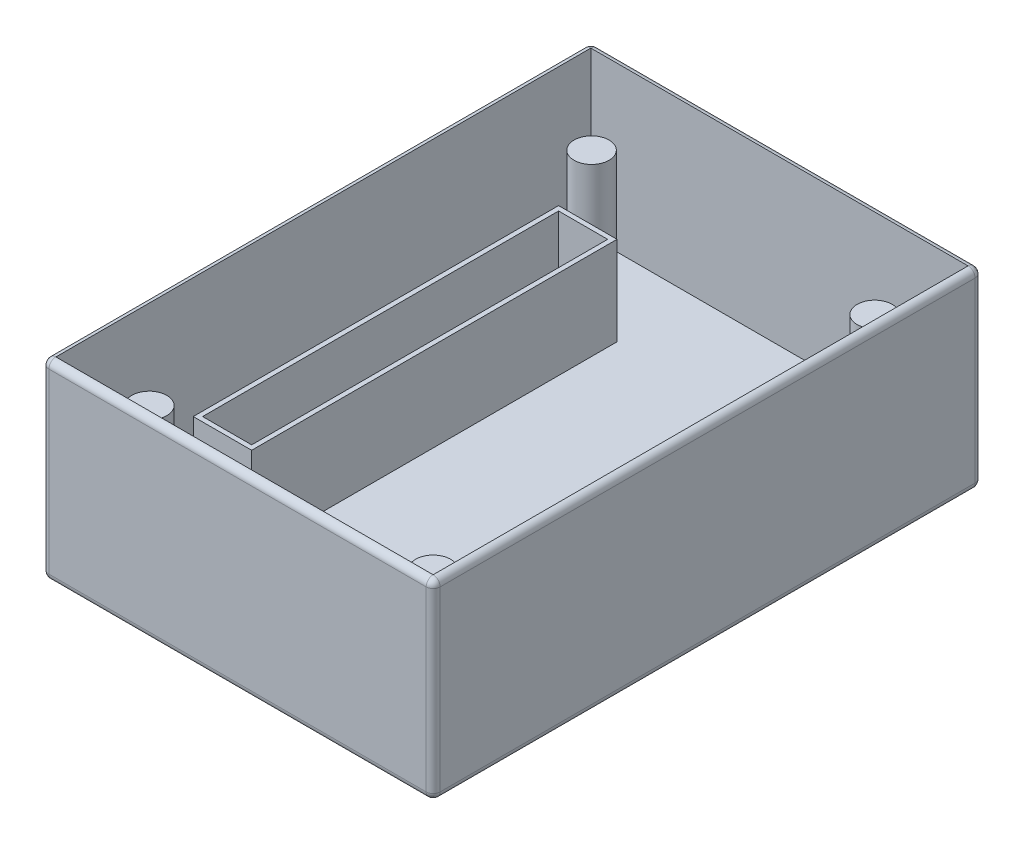
ISO-10303-21;
HEADER;
FILE_DESCRIPTION(('STEP AP214'),'2;1');
FILE_NAME('part.step','',(''),(''),'','','');
FILE_SCHEMA(('AUTOMOTIVE_DESIGN { 1 0 10303 214 1 1 1 1 }'));
ENDSEC;
DATA;
#1=APPLICATION_CONTEXT('core data for automotive mechanical design processes');
#2=APPLICATION_PROTOCOL_DEFINITION('international standard','automotive_design',2000,#1);
#3=PRODUCT_CONTEXT('',#1,'mechanical');
#4=PRODUCT('Part','Part','',(#3));
#5=PRODUCT_RELATED_PRODUCT_CATEGORY('part','',(#4));
#6=PRODUCT_DEFINITION_FORMATION('','',#4);
#7=PRODUCT_DEFINITION_CONTEXT('part definition',#1,'design');
#8=PRODUCT_DEFINITION('design','',#6,#7);
#9=PRODUCT_DEFINITION_SHAPE('','',#8);
#10=(LENGTH_UNIT() NAMED_UNIT(*) SI_UNIT(.MILLI.,.METRE.));
#11=(NAMED_UNIT(*) PLANE_ANGLE_UNIT() SI_UNIT($,.RADIAN.));
#12=(NAMED_UNIT(*) SI_UNIT($,.STERADIAN.) SOLID_ANGLE_UNIT());
#13=UNCERTAINTY_MEASURE_WITH_UNIT(LENGTH_MEASURE(1.E-05),#10,'distance_accuracy_value','');
#14=(GEOMETRIC_REPRESENTATION_CONTEXT(3) GLOBAL_UNCERTAINTY_ASSIGNED_CONTEXT((#13)) GLOBAL_UNIT_ASSIGNED_CONTEXT((#10,
#11,#12)) REPRESENTATION_CONTEXT('',''));
#15=CARTESIAN_POINT('',(0.,0.,0.));
#16=DIRECTION('',(0.,0.,1.));
#17=DIRECTION('',(1.,0.,0.));
#18=AXIS2_PLACEMENT_3D('',#15,#16,#17);
#19=CARTESIAN_POINT('',(0.,1.2,0.));
#20=DIRECTION('',(0.,1.,0.));
#21=DIRECTION('',(0.,0.,1.));
#22=AXIS2_PLACEMENT_3D('',#19,#20,#21);
#23=PLANE('',#22);
#24=CARTESIAN_POINT('',(2.3,1.2,2.26854426453604));
#25=DIRECTION('',(0.,1.,0.));
#26=DIRECTION('',(0.,0.,1.));
#27=AXIS2_PLACEMENT_3D('',#24,#25,#26);
#28=CIRCLE('',#27,0.75);
#29=CARTESIAN_POINT('',(2.3,1.2,3.01854426453604));
#30=VERTEX_POINT('',#29);
#31=EDGE_CURVE('E337',#30,#30,#28,.T.);
#32=ORIENTED_EDGE('',*,*,#31,.F.);
#33=EDGE_LOOP('',(#32));
#34=FACE_BOUND('',#33,.T.);
#35=CARTESIAN_POINT('',(2.3,1.2,21.2));
#36=DIRECTION('',(0.,1.,0.));
#37=DIRECTION('',(0.,0.,1.));
#38=AXIS2_PLACEMENT_3D('',#35,#36,#37);
#39=CIRCLE('',#38,0.75);
#40=CARTESIAN_POINT('',(2.3,1.2,21.95));
#41=VERTEX_POINT('',#40);
#42=EDGE_CURVE('E333',#41,#41,#39,.T.);
#43=ORIENTED_EDGE('',*,*,#42,.F.);
#44=EDGE_LOOP('',(#43));
#45=FACE_BOUND('',#44,.T.);
#46=CARTESIAN_POINT('',(14.45,1.2,21.2));
#47=DIRECTION('',(0.,1.,0.));
#48=DIRECTION('',(0.,0.,1.));
#49=AXIS2_PLACEMENT_3D('',#46,#47,#48);
#50=CIRCLE('',#49,0.75);
#51=CARTESIAN_POINT('',(14.45,1.2,21.95));
#52=VERTEX_POINT('',#51);
#53=EDGE_CURVE('E342',#52,#52,#50,.T.);
#54=ORIENTED_EDGE('',*,*,#53,.F.);
#55=EDGE_LOOP('',(#54));
#56=FACE_BOUND('',#55,.T.);
#57=CARTESIAN_POINT('',(14.45,1.2,2.3));
#58=DIRECTION('',(0.,1.,0.));
#59=DIRECTION('',(0.,0.,1.));
#60=AXIS2_PLACEMENT_3D('',#57,#58,#59);
#61=CIRCLE('',#60,0.75);
#62=CARTESIAN_POINT('',(14.45,1.2,3.05));
#63=VERTEX_POINT('',#62);
#64=EDGE_CURVE('E350',#63,#63,#61,.T.);
#65=ORIENTED_EDGE('',*,*,#64,.F.);
#66=EDGE_LOOP('',(#65));
#67=FACE_BOUND('',#66,.T.);
#68=DIRECTION('',(0.,0.,1.));
#69=VECTOR('',#68,1.);
#70=CARTESIAN_POINT('',(0.300000000000005,1.2,23.2));
#71=LINE('',#70,#69);
#72=CARTESIAN_POINT('',(0.3,1.2,0.3));
#73=VERTEX_POINT('',#72);
#74=CARTESIAN_POINT('',(0.300000000000005,1.2,23.2));
#75=VERTEX_POINT('',#74);
#76=EDGE_CURVE('E290',#73,#75,#71,.T.);
#77=ORIENTED_EDGE('',*,*,#76,.T.);
#78=DIRECTION('',(1.,0.,0.));
#79=VECTOR('',#78,1.);
#80=CARTESIAN_POINT('',(16.45,1.2,23.2));
#81=LINE('',#80,#79);
#82=CARTESIAN_POINT('',(16.45,1.2,23.2));
#83=VERTEX_POINT('',#82);
#84=EDGE_CURVE('E309',#75,#83,#81,.T.);
#85=ORIENTED_EDGE('',*,*,#84,.T.);
#86=DIRECTION('',(0.,0.,-1.));
#87=VECTOR('',#86,1.);
#88=CARTESIAN_POINT('',(16.45,1.2,0.3));
#89=LINE('',#88,#87);
#90=CARTESIAN_POINT('',(16.45,1.2,0.3));
#91=VERTEX_POINT('',#90);
#92=EDGE_CURVE('E312',#83,#91,#89,.T.);
#93=ORIENTED_EDGE('',*,*,#92,.T.);
#94=DIRECTION('',(-1.,0.,0.));
#95=VECTOR('',#94,1.);
#96=CARTESIAN_POINT('',(0.3,1.2,0.3));
#97=LINE('',#96,#95);
#98=EDGE_CURVE('E296',#91,#73,#97,.T.);
#99=ORIENTED_EDGE('',*,*,#98,.T.);
#100=EDGE_LOOP('',(#77,#85,#93,#99));
#101=FACE_BOUND('',#100,.T.);
#102=DIRECTION('',(1.,0.,0.));
#103=VECTOR('',#102,1.);
#104=CARTESIAN_POINT('',(4.75000000000001,1.2,19.27));
#105=LINE('',#104,#103);
#106=CARTESIAN_POINT('',(2.25,1.2,19.27));
#107=VERTEX_POINT('',#106);
#108=CARTESIAN_POINT('',(4.75000000000001,1.2,19.27));
#109=VERTEX_POINT('',#108);
#110=EDGE_CURVE('E267',#107,#109,#105,.T.);
#111=ORIENTED_EDGE('',*,*,#110,.F.);
#112=DIRECTION('',(0.,0.,1.));
#113=VECTOR('',#112,1.);
#114=CARTESIAN_POINT('',(2.25,1.2,3.63));
#115=LINE('',#114,#113);
#116=CARTESIAN_POINT('',(2.25,1.2,3.63));
#117=VERTEX_POINT('',#116);
#118=EDGE_CURVE('E216',#117,#107,#115,.T.);
#119=ORIENTED_EDGE('',*,*,#118,.F.);
#120=DIRECTION('',(-1.,0.,0.));
#121=VECTOR('',#120,1.);
#122=CARTESIAN_POINT('',(2.45,1.2,3.63));
#123=LINE('',#122,#121);
#124=CARTESIAN_POINT('',(4.75,1.2,3.63));
#125=VERTEX_POINT('',#124);
#126=EDGE_CURVE('E254',#125,#117,#123,.T.);
#127=ORIENTED_EDGE('',*,*,#126,.F.);
#128=DIRECTION('',(0.,0.,-1.));
#129=VECTOR('',#128,1.);
#130=CARTESIAN_POINT('',(4.75,1.2,3.63));
#131=LINE('',#130,#129);
#132=EDGE_CURVE('E270',#109,#125,#131,.T.);
#133=ORIENTED_EDGE('',*,*,#132,.F.);
#134=EDGE_LOOP('',(#111,#119,#127,#133));
#135=FACE_BOUND('',#134,.T.);
#136=ADVANCED_FACE('F45',(#34,#45,#56,#67,#101,#135),#23,.T.);
#137=CARTESIAN_POINT('',(2.3,6.4,2.26854426453604));
#138=DIRECTION('',(0.,-1.,0.));
#139=DIRECTION('',(0.,0.,-1.));
#140=AXIS2_PLACEMENT_3D('',#137,#138,#139);
#141=CYLINDRICAL_SURFACE('',#140,0.75);
#142=CARTESIAN_POINT('',(2.3,6.4,2.26854426453604));
#143=DIRECTION('',(0.,1.,0.));
#144=DIRECTION('',(0.,0.,1.));
#145=AXIS2_PLACEMENT_3D('',#142,#143,#144);
#146=CIRCLE('',#145,0.75);
#147=CARTESIAN_POINT('',(2.3,6.4,3.01854426453604));
#148=VERTEX_POINT('',#147);
#149=EDGE_CURVE('E357',#148,#148,#146,.T.);
#150=ORIENTED_EDGE('',*,*,#149,.F.);
#151=EDGE_LOOP('',(#150));
#152=FACE_BOUND('',#151,.T.);
#153=ORIENTED_EDGE('',*,*,#31,.T.);
#154=EDGE_LOOP('',(#153));
#155=FACE_BOUND('',#154,.T.);
#156=ADVANCED_FACE('F590',(#152,#155),#141,.T.);
#157=CARTESIAN_POINT('',(2.3,6.4,2.26854426453604));
#158=DIRECTION('',(0.,1.,0.));
#159=DIRECTION('',(0.,0.,1.));
#160=AXIS2_PLACEMENT_3D('',#157,#158,#159);
#161=PLANE('',#160);
#162=ORIENTED_EDGE('',*,*,#149,.T.);
#163=EDGE_LOOP('',(#162));
#164=FACE_BOUND('',#163,.T.);
#165=ADVANCED_FACE('F599',(#164),#161,.T.);
#166=CARTESIAN_POINT('',(2.3,6.4,21.2));
#167=DIRECTION('',(0.,-1.,0.));
#168=DIRECTION('',(0.,0.,-1.));
#169=AXIS2_PLACEMENT_3D('',#166,#167,#168);
#170=CYLINDRICAL_SURFACE('',#169,0.75);
#171=CARTESIAN_POINT('',(2.3,6.4,21.2));
#172=DIRECTION('',(0.,1.,0.));
#173=DIRECTION('',(0.,0.,1.));
#174=AXIS2_PLACEMENT_3D('',#171,#172,#173);
#175=CIRCLE('',#174,0.75);
#176=CARTESIAN_POINT('',(2.3,6.4,21.95));
#177=VERTEX_POINT('',#176);
#178=EDGE_CURVE('E338',#177,#177,#175,.T.);
#179=ORIENTED_EDGE('',*,*,#178,.F.);
#180=EDGE_LOOP('',(#179));
#181=FACE_BOUND('',#180,.T.);
#182=ORIENTED_EDGE('',*,*,#42,.T.);
#183=EDGE_LOOP('',(#182));
#184=FACE_BOUND('',#183,.T.);
#185=ADVANCED_FACE('F663',(#181,#184),#170,.T.);
#186=CARTESIAN_POINT('',(2.3,6.4,21.2));
#187=DIRECTION('',(0.,1.,0.));
#188=DIRECTION('',(0.,0.,1.));
#189=AXIS2_PLACEMENT_3D('',#186,#187,#188);
#190=PLANE('',#189);
#191=ORIENTED_EDGE('',*,*,#178,.T.);
#192=EDGE_LOOP('',(#191));
#193=FACE_BOUND('',#192,.T.);
#194=ADVANCED_FACE('F666',(#193),#190,.T.);
#195=CARTESIAN_POINT('',(14.45,6.4,21.2));
#196=DIRECTION('',(0.,-1.,0.));
#197=DIRECTION('',(0.,0.,-1.));
#198=AXIS2_PLACEMENT_3D('',#195,#196,#197);
#199=CYLINDRICAL_SURFACE('',#198,0.75);
#200=CARTESIAN_POINT('',(14.45,6.4,21.2));
#201=DIRECTION('',(0.,1.,0.));
#202=DIRECTION('',(0.,0.,1.));
#203=AXIS2_PLACEMENT_3D('',#200,#201,#202);
#204=CIRCLE('',#203,0.75);
#205=CARTESIAN_POINT('',(14.45,6.4,21.95));
#206=VERTEX_POINT('',#205);
#207=EDGE_CURVE('E346',#206,#206,#204,.T.);
#208=ORIENTED_EDGE('',*,*,#207,.F.);
#209=EDGE_LOOP('',(#208));
#210=FACE_BOUND('',#209,.T.);
#211=ORIENTED_EDGE('',*,*,#53,.T.);
#212=EDGE_LOOP('',(#211));
#213=FACE_BOUND('',#212,.T.);
#214=ADVANCED_FACE('F670',(#210,#213),#199,.T.);
#215=CARTESIAN_POINT('',(14.45,6.4,21.2));
#216=DIRECTION('',(0.,1.,0.));
#217=DIRECTION('',(0.,0.,1.));
#218=AXIS2_PLACEMENT_3D('',#215,#216,#217);
#219=PLANE('',#218);
#220=ORIENTED_EDGE('',*,*,#207,.T.);
#221=EDGE_LOOP('',(#220));
#222=FACE_BOUND('',#221,.T.);
#223=ADVANCED_FACE('F674',(#222),#219,.T.);
#224=CARTESIAN_POINT('',(14.45,6.4,2.3));
#225=DIRECTION('',(0.,-1.,0.));
#226=DIRECTION('',(0.,0.,-1.));
#227=AXIS2_PLACEMENT_3D('',#224,#225,#226);
#228=CYLINDRICAL_SURFACE('',#227,0.75);
#229=CARTESIAN_POINT('',(14.45,6.4,2.3));
#230=DIRECTION('',(0.,1.,0.));
#231=DIRECTION('',(0.,0.,1.));
#232=AXIS2_PLACEMENT_3D('',#229,#230,#231);
#233=CIRCLE('',#232,0.75);
#234=CARTESIAN_POINT('',(14.45,6.4,3.05));
#235=VERTEX_POINT('',#234);
#236=EDGE_CURVE('E332',#235,#235,#233,.T.);
#237=ORIENTED_EDGE('',*,*,#236,.F.);
#238=EDGE_LOOP('',(#237));
#239=FACE_BOUND('',#238,.T.);
#240=ORIENTED_EDGE('',*,*,#64,.T.);
#241=EDGE_LOOP('',(#240));
#242=FACE_BOUND('',#241,.T.);
#243=ADVANCED_FACE('F678',(#239,#242),#228,.T.);
#244=CARTESIAN_POINT('',(14.45,6.4,2.3));
#245=DIRECTION('',(0.,1.,0.));
#246=DIRECTION('',(0.,0.,1.));
#247=AXIS2_PLACEMENT_3D('',#244,#245,#246);
#248=PLANE('',#247);
#249=ORIENTED_EDGE('',*,*,#236,.T.);
#250=EDGE_LOOP('',(#249));
#251=FACE_BOUND('',#250,.T.);
#252=ADVANCED_FACE('F661',(#251),#248,.T.);
#253=CARTESIAN_POINT('',(0.300000000000005,8.2,23.2));
#254=DIRECTION('',(1.,0.,0.));
#255=DIRECTION('',(0.,0.,-1.));
#256=AXIS2_PLACEMENT_3D('',#253,#254,#255);
#257=PLANE('',#256);
#258=ORIENTED_EDGE('',*,*,#76,.F.);
#259=DIRECTION('',(0.,-1.,0.));
#260=VECTOR('',#259,1.);
#261=CARTESIAN_POINT('',(0.3,8.2,0.3));
#262=LINE('',#261,#260);
#263=CARTESIAN_POINT('',(0.3,8.2,0.3));
#264=VERTEX_POINT('',#263);
#265=EDGE_CURVE('E306',#264,#73,#262,.T.);
#266=ORIENTED_EDGE('',*,*,#265,.F.);
#267=DIRECTION('',(0.,0.,1.));
#268=VECTOR('',#267,1.);
#269=CARTESIAN_POINT('',(0.300000000000005,8.2,23.2));
#270=LINE('',#269,#268);
#271=CARTESIAN_POINT('',(0.300000000000005,8.2,23.2));
#272=VERTEX_POINT('',#271);
#273=EDGE_CURVE('E291',#264,#272,#270,.T.);
#274=ORIENTED_EDGE('',*,*,#273,.T.);
#275=DIRECTION('',(0.,-1.,0.));
#276=VECTOR('',#275,1.);
#277=CARTESIAN_POINT('',(0.300000000000005,8.2,23.2));
#278=LINE('',#277,#276);
#279=EDGE_CURVE('E328',#272,#75,#278,.T.);
#280=ORIENTED_EDGE('',*,*,#279,.T.);
#281=EDGE_LOOP('',(#258,#266,#274,#280));
#282=FACE_BOUND('',#281,.T.);
#283=ADVANCED_FACE('F658',(#282),#257,.T.);
#284=CARTESIAN_POINT('',(16.45,8.2,23.2));
#285=DIRECTION('',(0.,0.,-1.));
#286=DIRECTION('',(-1.,0.,0.));
#287=AXIS2_PLACEMENT_3D('',#284,#285,#286);
#288=PLANE('',#287);
#289=ORIENTED_EDGE('',*,*,#84,.F.);
#290=ORIENTED_EDGE('',*,*,#279,.F.);
#291=DIRECTION('',(1.,0.,0.));
#292=VECTOR('',#291,1.);
#293=CARTESIAN_POINT('',(16.45,8.2,23.2));
#294=LINE('',#293,#292);
#295=CARTESIAN_POINT('',(16.45,8.2,23.2));
#296=VERTEX_POINT('',#295);
#297=EDGE_CURVE('E295',#272,#296,#294,.T.);
#298=ORIENTED_EDGE('',*,*,#297,.T.);
#299=DIRECTION('',(0.,-1.,0.));
#300=VECTOR('',#299,1.);
#301=CARTESIAN_POINT('',(16.45,8.2,23.2));
#302=LINE('',#301,#300);
#303=EDGE_CURVE('E324',#296,#83,#302,.T.);
#304=ORIENTED_EDGE('',*,*,#303,.T.);
#305=EDGE_LOOP('',(#289,#290,#298,#304));
#306=FACE_BOUND('',#305,.T.);
#307=ADVANCED_FACE('F654',(#306),#288,.T.);
#308=CARTESIAN_POINT('',(16.45,8.2,0.3));
#309=DIRECTION('',(-1.,0.,0.));
#310=DIRECTION('',(0.,0.,1.));
#311=AXIS2_PLACEMENT_3D('',#308,#309,#310);
#312=PLANE('',#311);
#313=ORIENTED_EDGE('',*,*,#92,.F.);
#314=ORIENTED_EDGE('',*,*,#303,.F.);
#315=DIRECTION('',(0.,0.,-1.));
#316=VECTOR('',#315,1.);
#317=CARTESIAN_POINT('',(16.45,8.2,0.3));
#318=LINE('',#317,#316);
#319=CARTESIAN_POINT('',(16.45,8.2,0.3));
#320=VERTEX_POINT('',#319);
#321=EDGE_CURVE('E299',#296,#320,#318,.T.);
#322=ORIENTED_EDGE('',*,*,#321,.T.);
#323=DIRECTION('',(0.,-1.,0.));
#324=VECTOR('',#323,1.);
#325=CARTESIAN_POINT('',(16.45,8.2,0.3));
#326=LINE('',#325,#324);
#327=EDGE_CURVE('E320',#320,#91,#326,.T.);
#328=ORIENTED_EDGE('',*,*,#327,.T.);
#329=EDGE_LOOP('',(#313,#314,#322,#328));
#330=FACE_BOUND('',#329,.T.);
#331=ADVANCED_FACE('F650',(#330),#312,.T.);
#332=CARTESIAN_POINT('',(0.3,8.2,0.3));
#333=DIRECTION('',(0.,0.,1.));
#334=DIRECTION('',(1.,0.,0.));
#335=AXIS2_PLACEMENT_3D('',#332,#333,#334);
#336=PLANE('',#335);
#337=ORIENTED_EDGE('',*,*,#98,.F.);
#338=ORIENTED_EDGE('',*,*,#327,.F.);
#339=DIRECTION('',(-1.,0.,0.));
#340=VECTOR('',#339,1.);
#341=CARTESIAN_POINT('',(0.3,8.2,0.3));
#342=LINE('',#341,#340);
#343=EDGE_CURVE('E303',#320,#264,#342,.T.);
#344=ORIENTED_EDGE('',*,*,#343,.T.);
#345=ORIENTED_EDGE('',*,*,#265,.T.);
#346=EDGE_LOOP('',(#337,#338,#344,#345));
#347=FACE_BOUND('',#346,.T.);
#348=ADVANCED_FACE('F647',(#347),#336,.T.);
#349=CARTESIAN_POINT('',(0.,0.,0.));
#350=DIRECTION('',(0.,1.,0.));
#351=DIRECTION('',(0.,0.,1.));
#352=AXIS2_PLACEMENT_3D('',#349,#350,#351);
#353=PLANE('',#352);
#354=DIRECTION('',(0.,0.,1.));
#355=VECTOR('',#354,1.);
#356=CARTESIAN_POINT('',(16.45,0.,23.5));
#357=LINE('',#356,#355);
#358=CARTESIAN_POINT('',(16.45,0.,0.3));
#359=VERTEX_POINT('',#358);
#360=CARTESIAN_POINT('',(16.45,0.,23.2));
#361=VERTEX_POINT('',#360);
#362=EDGE_CURVE('E55',#359,#361,#357,.T.);
#363=ORIENTED_EDGE('',*,*,#362,.T.);
#364=DIRECTION('',(1.,0.,0.));
#365=VECTOR('',#364,1.);
#366=CARTESIAN_POINT('',(0.,0.,23.2));
#367=LINE('',#366,#365);
#368=CARTESIAN_POINT('',(0.300000000000003,0.,23.2));
#369=VERTEX_POINT('',#368);
#370=EDGE_CURVE('E11',#361,#369,#367,.F.);
#371=ORIENTED_EDGE('',*,*,#370,.T.);
#372=DIRECTION('',(0.,0.,1.));
#373=VECTOR('',#372,1.);
#374=CARTESIAN_POINT('',(0.3,0.,0.));
#375=LINE('',#374,#373);
#376=CARTESIAN_POINT('',(0.3,0.,0.3));
#377=VERTEX_POINT('',#376);
#378=EDGE_CURVE('E416',#369,#377,#375,.F.);
#379=ORIENTED_EDGE('',*,*,#378,.T.);
#380=DIRECTION('',(1.,0.,0.));
#381=VECTOR('',#380,1.);
#382=CARTESIAN_POINT('',(16.75,0.,0.3));
#383=LINE('',#382,#381);
#384=EDGE_CURVE('E66',#377,#359,#383,.T.);
#385=ORIENTED_EDGE('',*,*,#384,.T.);
#386=EDGE_LOOP('',(#363,#371,#379,#385));
#387=FACE_BOUND('',#386,.T.);
#388=ADVANCED_FACE('F557',(#387),#353,.F.);
#389=CARTESIAN_POINT('',(0.,1.2,0.));
#390=DIRECTION('',(0.,0.,-1.));
#391=DIRECTION('',(-1.,0.,0.));
#392=AXIS2_PLACEMENT_3D('',#389,#390,#391);
#393=PLANE('',#392);
#394=DIRECTION('',(0.,-1.,0.));
#395=VECTOR('',#394,1.);
#396=CARTESIAN_POINT('',(0.3,8.2,0.));
#397=LINE('',#396,#395);
#398=CARTESIAN_POINT('',(0.3,0.3,0.));
#399=VERTEX_POINT('',#398);
#400=CARTESIAN_POINT('',(0.3,7.9,0.));
#401=VERTEX_POINT('',#400);
#402=EDGE_CURVE('E383',#399,#401,#397,.F.);
#403=ORIENTED_EDGE('',*,*,#402,.T.);
#404=DIRECTION('',(-1.,0.,0.));
#405=VECTOR('',#404,1.);
#406=CARTESIAN_POINT('',(16.75,7.9,0.));
#407=LINE('',#406,#405);
#408=CARTESIAN_POINT('',(16.45,7.9,0.));
#409=VERTEX_POINT('',#408);
#410=EDGE_CURVE('E386',#401,#409,#407,.F.);
#411=ORIENTED_EDGE('',*,*,#410,.T.);
#412=DIRECTION('',(0.,-1.,0.));
#413=VECTOR('',#412,1.);
#414=CARTESIAN_POINT('',(16.45,1.2,0.));
#415=LINE('',#414,#413);
#416=CARTESIAN_POINT('',(16.45,0.3,0.));
#417=VERTEX_POINT('',#416);
#418=EDGE_CURVE('E380',#409,#417,#415,.T.);
#419=ORIENTED_EDGE('',*,*,#418,.T.);
#420=DIRECTION('',(1.,0.,0.));
#421=VECTOR('',#420,1.);
#422=CARTESIAN_POINT('',(0.,0.3,0.));
#423=LINE('',#422,#421);
#424=EDGE_CURVE('E377',#417,#399,#423,.F.);
#425=ORIENTED_EDGE('',*,*,#424,.T.);
#426=EDGE_LOOP('',(#403,#411,#419,#425));
#427=FACE_BOUND('',#426,.T.);
#428=ADVANCED_FACE('F527',(#427),#393,.T.);
#429=CARTESIAN_POINT('',(16.75,1.2,0.));
#430=DIRECTION('',(1.,0.,0.));
#431=DIRECTION('',(0.,0.,-1.));
#432=AXIS2_PLACEMENT_3D('',#429,#430,#431);
#433=PLANE('',#432);
#434=DIRECTION('',(0.,-1.,0.));
#435=VECTOR('',#434,1.);
#436=CARTESIAN_POINT('',(16.75,1.2,0.3));
#437=LINE('',#436,#435);
#438=CARTESIAN_POINT('',(16.75,0.3,0.3));
#439=VERTEX_POINT('',#438);
#440=CARTESIAN_POINT('',(16.75,7.9,0.3));
#441=VERTEX_POINT('',#440);
#442=EDGE_CURVE('E396',#439,#441,#437,.F.);
#443=ORIENTED_EDGE('',*,*,#442,.T.);
#444=DIRECTION('',(0.,0.,-1.));
#445=VECTOR('',#444,1.);
#446=CARTESIAN_POINT('',(16.75,7.9,23.5));
#447=LINE('',#446,#445);
#448=CARTESIAN_POINT('',(16.75,7.9,23.2));
#449=VERTEX_POINT('',#448);
#450=EDGE_CURVE('E399',#441,#449,#447,.F.);
#451=ORIENTED_EDGE('',*,*,#450,.T.);
#452=DIRECTION('',(0.,-1.,0.));
#453=VECTOR('',#452,1.);
#454=CARTESIAN_POINT('',(16.75,0.,23.2));
#455=LINE('',#454,#453);
#456=CARTESIAN_POINT('',(16.75,0.3,23.2));
#457=VERTEX_POINT('',#456);
#458=EDGE_CURVE('E393',#449,#457,#455,.T.);
#459=ORIENTED_EDGE('',*,*,#458,.T.);
#460=DIRECTION('',(0.,0.,1.));
#461=VECTOR('',#460,1.);
#462=CARTESIAN_POINT('',(16.75,0.3,0.));
#463=LINE('',#462,#461);
#464=EDGE_CURVE('E390',#457,#439,#463,.F.);
#465=ORIENTED_EDGE('',*,*,#464,.T.);
#466=EDGE_LOOP('',(#443,#451,#459,#465));
#467=FACE_BOUND('',#466,.T.);
#468=ADVANCED_FACE('F536',(#467),#433,.T.);
#469=CARTESIAN_POINT('',(0.,1.2,23.5));
#470=DIRECTION('',(0.,0.,-1.));
#471=DIRECTION('',(-1.,0.,0.));
#472=AXIS2_PLACEMENT_3D('',#469,#470,#471);
#473=PLANE('',#472);
#474=DIRECTION('',(1.,0.,0.));
#475=VECTOR('',#474,1.);
#476=CARTESIAN_POINT('',(0.,7.9,23.5));
#477=LINE('',#476,#475);
#478=CARTESIAN_POINT('',(16.45,7.9,23.5));
#479=VERTEX_POINT('',#478);
#480=CARTESIAN_POINT('',(0.300000000000003,7.9,23.5));
#481=VERTEX_POINT('',#480);
#482=EDGE_CURVE('E409',#479,#481,#477,.F.);
#483=ORIENTED_EDGE('',*,*,#482,.T.);
#484=DIRECTION('',(0.,-1.,0.));
#485=VECTOR('',#484,1.);
#486=CARTESIAN_POINT('',(0.300000000000003,1.2,23.5));
#487=LINE('',#486,#485);
#488=CARTESIAN_POINT('',(0.300000000000003,0.3,23.5));
#489=VERTEX_POINT('',#488);
#490=EDGE_CURVE('E412',#481,#489,#487,.T.);
#491=ORIENTED_EDGE('',*,*,#490,.T.);
#492=DIRECTION('',(1.,0.,0.));
#493=VECTOR('',#492,1.);
#494=CARTESIAN_POINT('',(0.,0.3,23.5));
#495=LINE('',#494,#493);
#496=CARTESIAN_POINT('',(16.45,0.3,23.5));
#497=VERTEX_POINT('',#496);
#498=EDGE_CURVE('E403',#489,#497,#495,.T.);
#499=ORIENTED_EDGE('',*,*,#498,.T.);
#500=DIRECTION('',(0.,-1.,0.));
#501=VECTOR('',#500,1.);
#502=CARTESIAN_POINT('',(16.45,8.2,23.5));
#503=LINE('',#502,#501);
#504=EDGE_CURVE('E406',#497,#479,#503,.F.);
#505=ORIENTED_EDGE('',*,*,#504,.T.);
#506=EDGE_LOOP('',(#483,#491,#499,#505));
#507=FACE_BOUND('',#506,.T.);
#508=ADVANCED_FACE('F769',(#507),#473,.F.);
#509=CARTESIAN_POINT('',(0.,1.2,0.));
#510=DIRECTION('',(1.,0.,0.));
#511=DIRECTION('',(0.,0.,-1.));
#512=AXIS2_PLACEMENT_3D('',#509,#510,#511);
#513=PLANE('',#512);
#514=DIRECTION('',(0.,-1.,0.));
#515=VECTOR('',#514,1.);
#516=CARTESIAN_POINT('',(0.,1.2,23.2));
#517=LINE('',#516,#515);
#518=CARTESIAN_POINT('',(0.,0.3,23.2));
#519=VERTEX_POINT('',#518);
#520=CARTESIAN_POINT('',(0.,7.9,23.2));
#521=VERTEX_POINT('',#520);
#522=EDGE_CURVE('E367',#519,#521,#517,.F.);
#523=ORIENTED_EDGE('',*,*,#522,.T.);
#524=DIRECTION('',(0.,0.,1.));
#525=VECTOR('',#524,1.);
#526=CARTESIAN_POINT('',(0.,7.9,0.));
#527=LINE('',#526,#525);
#528=CARTESIAN_POINT('',(0.,7.9,0.3));
#529=VERTEX_POINT('',#528);
#530=EDGE_CURVE('E373',#521,#529,#527,.F.);
#531=ORIENTED_EDGE('',*,*,#530,.T.);
#532=DIRECTION('',(0.,-1.,0.));
#533=VECTOR('',#532,1.);
#534=CARTESIAN_POINT('',(0.,0.,0.3));
#535=LINE('',#534,#533);
#536=CARTESIAN_POINT('',(0.,0.3,0.3));
#537=VERTEX_POINT('',#536);
#538=EDGE_CURVE('E370',#529,#537,#535,.T.);
#539=ORIENTED_EDGE('',*,*,#538,.T.);
#540=DIRECTION('',(0.,0.,1.));
#541=VECTOR('',#540,1.);
#542=CARTESIAN_POINT('',(0.,0.3,0.));
#543=LINE('',#542,#541);
#544=EDGE_CURVE('E361',#537,#519,#543,.T.);
#545=ORIENTED_EDGE('',*,*,#544,.T.);
#546=EDGE_LOOP('',(#523,#531,#539,#545));
#547=FACE_BOUND('',#546,.T.);
#548=ADVANCED_FACE('F631',(#547),#513,.F.);
#549=CARTESIAN_POINT('',(0.,5.,0.));
#550=DIRECTION('',(0.,1.,0.));
#551=DIRECTION('',(0.,0.,1.));
#552=AXIS2_PLACEMENT_3D('',#549,#550,#551);
#553=PLANE('',#552);
#554=DIRECTION('',(-1.,0.,0.));
#555=VECTOR('',#554,1.);
#556=CARTESIAN_POINT('',(2.45,5.,3.63));
#557=LINE('',#556,#555);
#558=CARTESIAN_POINT('',(4.75,5.,3.63));
#559=VERTEX_POINT('',#558);
#560=CARTESIAN_POINT('',(2.25,5.,3.63));
#561=VERTEX_POINT('',#560);
#562=EDGE_CURVE('E249',#559,#561,#557,.T.);
#563=ORIENTED_EDGE('',*,*,#562,.T.);
#564=DIRECTION('',(0.,0.,1.));
#565=VECTOR('',#564,1.);
#566=CARTESIAN_POINT('',(2.25,5.,3.63));
#567=LINE('',#566,#565);
#568=CARTESIAN_POINT('',(2.25,5.,19.27));
#569=VERTEX_POINT('',#568);
#570=EDGE_CURVE('E253',#561,#569,#567,.T.);
#571=ORIENTED_EDGE('',*,*,#570,.T.);
#572=DIRECTION('',(1.,0.,0.));
#573=VECTOR('',#572,1.);
#574=CARTESIAN_POINT('',(4.75000000000001,5.,19.27));
#575=LINE('',#574,#573);
#576=CARTESIAN_POINT('',(4.75000000000001,5.,19.27));
#577=VERTEX_POINT('',#576);
#578=EDGE_CURVE('E257',#569,#577,#575,.T.);
#579=ORIENTED_EDGE('',*,*,#578,.T.);
#580=DIRECTION('',(0.,0.,-1.));
#581=VECTOR('',#580,1.);
#582=CARTESIAN_POINT('',(4.75,5.,3.63));
#583=LINE('',#582,#581);
#584=EDGE_CURVE('E260',#577,#559,#583,.T.);
#585=ORIENTED_EDGE('',*,*,#584,.T.);
#586=EDGE_LOOP('',(#563,#571,#579,#585));
#587=FACE_BOUND('',#586,.T.);
#588=DIRECTION('',(1.,0.,0.));
#589=VECTOR('',#588,1.);
#590=CARTESIAN_POINT('',(2.45,5.,19.07));
#591=LINE('',#590,#589);
#592=CARTESIAN_POINT('',(2.45,5.,19.07));
#593=VERTEX_POINT('',#592);
#594=CARTESIAN_POINT('',(4.55,5.,19.07));
#595=VERTEX_POINT('',#594);
#596=EDGE_CURVE('E206',#593,#595,#591,.T.);
#597=ORIENTED_EDGE('',*,*,#596,.F.);
#598=DIRECTION('',(0.,0.,1.));
#599=VECTOR('',#598,1.);
#600=CARTESIAN_POINT('',(2.45,5.,3.83));
#601=LINE('',#600,#599);
#602=CARTESIAN_POINT('',(2.45,5.,3.83));
#603=VERTEX_POINT('',#602);
#604=EDGE_CURVE('E195',#603,#593,#601,.T.);
#605=ORIENTED_EDGE('',*,*,#604,.F.);
#606=DIRECTION('',(-1.,0.,0.));
#607=VECTOR('',#606,1.);
#608=CARTESIAN_POINT('',(4.55,5.,3.83));
#609=LINE('',#608,#607);
#610=CARTESIAN_POINT('',(4.55,5.,3.83));
#611=VERTEX_POINT('',#610);
#612=EDGE_CURVE('E226',#611,#603,#609,.T.);
#613=ORIENTED_EDGE('',*,*,#612,.F.);
#614=DIRECTION('',(0.,0.,-1.));
#615=VECTOR('',#614,1.);
#616=CARTESIAN_POINT('',(4.55,5.,19.07));
#617=LINE('',#616,#615);
#618=EDGE_CURVE('E222',#595,#611,#617,.T.);
#619=ORIENTED_EDGE('',*,*,#618,.F.);
#620=EDGE_LOOP('',(#597,#605,#613,#619));
#621=FACE_BOUND('',#620,.T.);
#622=ADVANCED_FACE('F220',(#587,#621),#553,.T.);
#623=CARTESIAN_POINT('',(2.25,5.,3.63));
#624=DIRECTION('',(1.,0.,0.));
#625=DIRECTION('',(0.,0.,-1.));
#626=AXIS2_PLACEMENT_3D('',#623,#624,#625);
#627=PLANE('',#626);
#628=ORIENTED_EDGE('',*,*,#118,.T.);
#629=DIRECTION('',(0.,-1.,0.));
#630=VECTOR('',#629,1.);
#631=CARTESIAN_POINT('',(2.25,5.,19.27));
#632=LINE('',#631,#630);
#633=EDGE_CURVE('E282',#569,#107,#632,.T.);
#634=ORIENTED_EDGE('',*,*,#633,.F.);
#635=ORIENTED_EDGE('',*,*,#570,.F.);
#636=DIRECTION('',(0.,-1.,0.));
#637=VECTOR('',#636,1.);
#638=CARTESIAN_POINT('',(2.25,5.,3.63));
#639=LINE('',#638,#637);
#640=EDGE_CURVE('E286',#561,#117,#639,.T.);
#641=ORIENTED_EDGE('',*,*,#640,.T.);
#642=EDGE_LOOP('',(#628,#634,#635,#641));
#643=FACE_BOUND('',#642,.T.);
#644=ADVANCED_FACE('F630',(#643),#627,.F.);
#645=CARTESIAN_POINT('',(4.75000000000001,5.,19.27));
#646=DIRECTION('',(0.,0.,-1.));
#647=DIRECTION('',(-1.,0.,0.));
#648=AXIS2_PLACEMENT_3D('',#645,#646,#647);
#649=PLANE('',#648);
#650=ORIENTED_EDGE('',*,*,#110,.T.);
#651=DIRECTION('',(0.,-1.,0.));
#652=VECTOR('',#651,1.);
#653=CARTESIAN_POINT('',(4.75000000000001,5.,19.27));
#654=LINE('',#653,#652);
#655=EDGE_CURVE('E278',#577,#109,#654,.T.);
#656=ORIENTED_EDGE('',*,*,#655,.F.);
#657=ORIENTED_EDGE('',*,*,#578,.F.);
#658=ORIENTED_EDGE('',*,*,#633,.T.);
#659=EDGE_LOOP('',(#650,#656,#657,#658));
#660=FACE_BOUND('',#659,.T.);
#661=ADVANCED_FACE('F639',(#660),#649,.F.);
#662=CARTESIAN_POINT('',(4.75,5.,3.63));
#663=DIRECTION('',(-1.,0.,0.));
#664=DIRECTION('',(0.,0.,1.));
#665=AXIS2_PLACEMENT_3D('',#662,#663,#664);
#666=PLANE('',#665);
#667=ORIENTED_EDGE('',*,*,#132,.T.);
#668=DIRECTION('',(0.,-1.,0.));
#669=VECTOR('',#668,1.);
#670=CARTESIAN_POINT('',(4.75,5.,3.63));
#671=LINE('',#670,#669);
#672=EDGE_CURVE('E264',#559,#125,#671,.T.);
#673=ORIENTED_EDGE('',*,*,#672,.F.);
#674=ORIENTED_EDGE('',*,*,#584,.F.);
#675=ORIENTED_EDGE('',*,*,#655,.T.);
#676=EDGE_LOOP('',(#667,#673,#674,#675));
#677=FACE_BOUND('',#676,.T.);
#678=ADVANCED_FACE('F635',(#677),#666,.F.);
#679=CARTESIAN_POINT('',(2.45,5.,3.63));
#680=DIRECTION('',(0.,0.,1.));
#681=DIRECTION('',(1.,0.,0.));
#682=AXIS2_PLACEMENT_3D('',#679,#680,#681);
#683=PLANE('',#682);
#684=ORIENTED_EDGE('',*,*,#126,.T.);
#685=ORIENTED_EDGE('',*,*,#640,.F.);
#686=ORIENTED_EDGE('',*,*,#562,.F.);
#687=ORIENTED_EDGE('',*,*,#672,.T.);
#688=EDGE_LOOP('',(#684,#685,#686,#687));
#689=FACE_BOUND('',#688,.T.);
#690=ADVANCED_FACE('F628',(#689),#683,.F.);
#691=CARTESIAN_POINT('',(2.45,5.,3.83));
#692=DIRECTION('',(1.,0.,0.));
#693=DIRECTION('',(0.,0.,-1.));
#694=AXIS2_PLACEMENT_3D('',#691,#692,#693);
#695=PLANE('',#694);
#696=DIRECTION('',(0.,0.,1.));
#697=VECTOR('',#696,1.);
#698=CARTESIAN_POINT('',(2.45,1.2,3.83));
#699=LINE('',#698,#697);
#700=CARTESIAN_POINT('',(2.45,1.2,3.83));
#701=VERTEX_POINT('',#700);
#702=CARTESIAN_POINT('',(2.45,1.2,19.07));
#703=VERTEX_POINT('',#702);
#704=EDGE_CURVE('E231',#701,#703,#699,.T.);
#705=ORIENTED_EDGE('',*,*,#704,.F.);
#706=DIRECTION('',(0.,-1.,0.));
#707=VECTOR('',#706,1.);
#708=CARTESIAN_POINT('',(2.45,5.,3.83));
#709=LINE('',#708,#707);
#710=EDGE_CURVE('E201',#603,#701,#709,.T.);
#711=ORIENTED_EDGE('',*,*,#710,.F.);
#712=ORIENTED_EDGE('',*,*,#604,.T.);
#713=DIRECTION('',(0.,-1.,0.));
#714=VECTOR('',#713,1.);
#715=CARTESIAN_POINT('',(2.45,5.,19.07));
#716=LINE('',#715,#714);
#717=EDGE_CURVE('E199',#593,#703,#716,.T.);
#718=ORIENTED_EDGE('',*,*,#717,.T.);
#719=EDGE_LOOP('',(#705,#711,#712,#718));
#720=FACE_BOUND('',#719,.T.);
#721=ADVANCED_FACE('F198',(#720),#695,.T.);
#722=CARTESIAN_POINT('',(2.45,5.,19.07));
#723=DIRECTION('',(0.,0.,-1.));
#724=DIRECTION('',(-1.,0.,0.));
#725=AXIS2_PLACEMENT_3D('',#722,#723,#724);
#726=PLANE('',#725);
#727=DIRECTION('',(1.,0.,0.));
#728=VECTOR('',#727,1.);
#729=CARTESIAN_POINT('',(2.45,1.2,19.07));
#730=LINE('',#729,#728);
#731=CARTESIAN_POINT('',(4.55,1.2,19.07));
#732=VERTEX_POINT('',#731);
#733=EDGE_CURVE('E214',#703,#732,#730,.T.);
#734=ORIENTED_EDGE('',*,*,#733,.F.);
#735=ORIENTED_EDGE('',*,*,#717,.F.);
#736=ORIENTED_EDGE('',*,*,#596,.T.);
#737=DIRECTION('',(0.,-1.,0.));
#738=VECTOR('',#737,1.);
#739=CARTESIAN_POINT('',(4.55,5.,19.07));
#740=LINE('',#739,#738);
#741=EDGE_CURVE('E217',#595,#732,#740,.T.);
#742=ORIENTED_EDGE('',*,*,#741,.T.);
#743=EDGE_LOOP('',(#734,#735,#736,#742));
#744=FACE_BOUND('',#743,.T.);
#745=ADVANCED_FACE('F211',(#744),#726,.T.);
#746=CARTESIAN_POINT('',(4.55,5.,19.07));
#747=DIRECTION('',(-1.,0.,0.));
#748=DIRECTION('',(0.,0.,1.));
#749=AXIS2_PLACEMENT_3D('',#746,#747,#748);
#750=PLANE('',#749);
#751=DIRECTION('',(0.,0.,-1.));
#752=VECTOR('',#751,1.);
#753=CARTESIAN_POINT('',(4.55,1.2,19.07));
#754=LINE('',#753,#752);
#755=CARTESIAN_POINT('',(4.55,1.2,3.83));
#756=VERTEX_POINT('',#755);
#757=EDGE_CURVE('E236',#732,#756,#754,.T.);
#758=ORIENTED_EDGE('',*,*,#757,.F.);
#759=ORIENTED_EDGE('',*,*,#741,.F.);
#760=ORIENTED_EDGE('',*,*,#618,.T.);
#761=DIRECTION('',(0.,-1.,0.));
#762=VECTOR('',#761,1.);
#763=CARTESIAN_POINT('',(4.55,5.,3.83));
#764=LINE('',#763,#762);
#765=EDGE_CURVE('E243',#611,#756,#764,.T.);
#766=ORIENTED_EDGE('',*,*,#765,.T.);
#767=EDGE_LOOP('',(#758,#759,#760,#766));
#768=FACE_BOUND('',#767,.T.);
#769=ADVANCED_FACE('F613',(#768),#750,.T.);
#770=CARTESIAN_POINT('',(4.55,5.,3.83));
#771=DIRECTION('',(0.,0.,1.));
#772=DIRECTION('',(1.,0.,0.));
#773=AXIS2_PLACEMENT_3D('',#770,#771,#772);
#774=PLANE('',#773);
#775=DIRECTION('',(-1.,0.,0.));
#776=VECTOR('',#775,1.);
#777=CARTESIAN_POINT('',(4.55,1.2,3.83));
#778=LINE('',#777,#776);
#779=EDGE_CURVE('E207',#756,#701,#778,.T.);
#780=ORIENTED_EDGE('',*,*,#779,.F.);
#781=ORIENTED_EDGE('',*,*,#765,.F.);
#782=ORIENTED_EDGE('',*,*,#612,.T.);
#783=ORIENTED_EDGE('',*,*,#710,.T.);
#784=EDGE_LOOP('',(#780,#781,#782,#783));
#785=FACE_BOUND('',#784,.T.);
#786=ADVANCED_FACE('F606',(#785),#774,.T.);
#787=ORIENTED_EDGE('',*,*,#704,.T.);
#788=ORIENTED_EDGE('',*,*,#733,.T.);
#789=ORIENTED_EDGE('',*,*,#757,.T.);
#790=ORIENTED_EDGE('',*,*,#779,.T.);
#791=EDGE_LOOP('',(#787,#788,#789,#790));
#792=FACE_BOUND('',#791,.T.);
#793=ADVANCED_FACE('F593',(#792),#23,.T.);
#794=CARTESIAN_POINT('',(16.45,0.3,0.));
#795=DIRECTION('',(0.,0.,-1.));
#796=DIRECTION('',(-1.,0.,0.));
#797=AXIS2_PLACEMENT_3D('',#794,#795,#796);
#798=CYLINDRICAL_SURFACE('',#797,0.3);
#799=CARTESIAN_POINT('',(16.45,0.3,0.3));
#800=DIRECTION('',(0.,0.,-1.));
#801=DIRECTION('',(-1.,0.,0.));
#802=AXIS2_PLACEMENT_3D('',#799,#800,#801);
#803=CIRCLE('',#802,0.3);
#804=EDGE_CURVE('E49',#439,#359,#803,.T.);
#805=ORIENTED_EDGE('',*,*,#804,.F.);
#806=ORIENTED_EDGE('',*,*,#464,.F.);
#807=CARTESIAN_POINT('',(16.45,0.3,23.2));
#808=DIRECTION('',(0.,0.,1.));
#809=DIRECTION('',(1.,0.,0.));
#810=AXIS2_PLACEMENT_3D('',#807,#808,#809);
#811=CIRCLE('',#810,0.3);
#812=EDGE_CURVE('E504',#361,#457,#811,.T.);
#813=ORIENTED_EDGE('',*,*,#812,.F.);
#814=ORIENTED_EDGE('',*,*,#362,.F.);
#815=EDGE_LOOP('',(#805,#806,#813,#814));
#816=FACE_BOUND('',#815,.T.);
#817=ADVANCED_FACE('F47',(#816),#798,.T.);
#818=CARTESIAN_POINT('',(16.45,0.3,0.3));
#819=DIRECTION('',(0.,-1.,0.));
#820=DIRECTION('',(0.,0.,-1.));
#821=AXIS2_PLACEMENT_3D('',#818,#819,#820);
#822=SPHERICAL_SURFACE('',#821,0.3);
#823=CARTESIAN_POINT('',(16.45,0.3,0.3));
#824=DIRECTION('',(0.,-1.,0.));
#825=DIRECTION('',(0.,0.,-1.));
#826=AXIS2_PLACEMENT_3D('',#823,#824,#825);
#827=CIRCLE('',#826,0.3);
#828=EDGE_CURVE('E497',#439,#417,#827,.F.);
#829=ORIENTED_EDGE('',*,*,#828,.F.);
#830=ORIENTED_EDGE('',*,*,#804,.T.);
#831=CARTESIAN_POINT('',(16.45,0.3,0.3));
#832=DIRECTION('',(1.,0.,0.));
#833=DIRECTION('',(0.,0.,-1.));
#834=AXIS2_PLACEMENT_3D('',#831,#832,#833);
#835=CIRCLE('',#834,0.3);
#836=EDGE_CURVE('E501',#417,#359,#835,.F.);
#837=ORIENTED_EDGE('',*,*,#836,.F.);
#838=EDGE_LOOP('',(#829,#830,#837));
#839=FACE_BOUND('',#838,.T.);
#840=ADVANCED_FACE('F516',(#839),#822,.T.);
#841=CARTESIAN_POINT('',(16.45,0.3,23.2));
#842=DIRECTION('',(1.,0.,0.));
#843=DIRECTION('',(0.,0.,-1.));
#844=AXIS2_PLACEMENT_3D('',#841,#842,#843);
#845=SPHERICAL_SURFACE('',#844,0.3);
#846=CARTESIAN_POINT('',(16.45,0.3,23.2));
#847=DIRECTION('',(1.,0.,0.));
#848=DIRECTION('',(0.,0.,-1.));
#849=AXIS2_PLACEMENT_3D('',#846,#847,#848);
#850=CIRCLE('',#849,0.3);
#851=EDGE_CURVE('E489',#361,#497,#850,.F.);
#852=ORIENTED_EDGE('',*,*,#851,.F.);
#853=ORIENTED_EDGE('',*,*,#812,.T.);
#854=CARTESIAN_POINT('',(16.45,0.3,23.2));
#855=DIRECTION('',(0.,-1.,0.));
#856=DIRECTION('',(0.,0.,-1.));
#857=AXIS2_PLACEMENT_3D('',#854,#855,#856);
#858=CIRCLE('',#857,0.3);
#859=EDGE_CURVE('E493',#497,#457,#858,.F.);
#860=ORIENTED_EDGE('',*,*,#859,.F.);
#861=EDGE_LOOP('',(#852,#853,#860));
#862=FACE_BOUND('',#861,.T.);
#863=ADVANCED_FACE('F551',(#862),#845,.T.);
#864=CARTESIAN_POINT('',(0.,0.3,0.3));
#865=DIRECTION('',(-1.,0.,0.));
#866=DIRECTION('',(0.,0.,1.));
#867=AXIS2_PLACEMENT_3D('',#864,#865,#866);
#868=CYLINDRICAL_SURFACE('',#867,0.3);
#869=ORIENTED_EDGE('',*,*,#836,.T.);
#870=ORIENTED_EDGE('',*,*,#384,.F.);
#871=CARTESIAN_POINT('',(0.3,0.3,0.3));
#872=DIRECTION('',(-1.,0.,0.));
#873=DIRECTION('',(0.,0.,1.));
#874=AXIS2_PLACEMENT_3D('',#871,#872,#873);
#875=CIRCLE('',#874,0.3);
#876=EDGE_CURVE('E481',#399,#377,#875,.T.);
#877=ORIENTED_EDGE('',*,*,#876,.F.);
#878=ORIENTED_EDGE('',*,*,#424,.F.);
#879=EDGE_LOOP('',(#869,#870,#877,#878));
#880=FACE_BOUND('',#879,.T.);
#881=ADVANCED_FACE('F522',(#880),#868,.T.);
#882=CARTESIAN_POINT('',(16.45,1.2,0.3));
#883=DIRECTION('',(0.,-1.,0.));
#884=DIRECTION('',(0.,0.,-1.));
#885=AXIS2_PLACEMENT_3D('',#882,#883,#884);
#886=CYLINDRICAL_SURFACE('',#885,0.3);
#887=ORIENTED_EDGE('',*,*,#828,.T.);
#888=ORIENTED_EDGE('',*,*,#418,.F.);
#889=CARTESIAN_POINT('',(16.45,7.9,0.3));
#890=DIRECTION('',(0.,1.,0.));
#891=DIRECTION('',(0.,0.,1.));
#892=AXIS2_PLACEMENT_3D('',#889,#890,#891);
#893=CIRCLE('',#892,0.3);
#894=EDGE_CURVE('E477',#441,#409,#893,.T.);
#895=ORIENTED_EDGE('',*,*,#894,.F.);
#896=ORIENTED_EDGE('',*,*,#442,.F.);
#897=EDGE_LOOP('',(#887,#888,#895,#896));
#898=FACE_BOUND('',#897,.T.);
#899=ADVANCED_FACE('F533',(#898),#886,.T.);
#900=CARTESIAN_POINT('',(16.45,7.9,0.));
#901=DIRECTION('',(0.,0.,1.));
#902=DIRECTION('',(1.,0.,0.));
#903=AXIS2_PLACEMENT_3D('',#900,#901,#902);
#904=CYLINDRICAL_SURFACE('',#903,0.3);
#905=CARTESIAN_POINT('',(16.45,7.9,23.2));
#906=DIRECTION('',(0.,0.,1.));
#907=DIRECTION('',(1.,0.,0.));
#908=AXIS2_PLACEMENT_3D('',#905,#906,#907);
#909=CIRCLE('',#908,0.3);
#910=EDGE_CURVE('E469',#449,#296,#909,.T.);
#911=ORIENTED_EDGE('',*,*,#910,.F.);
#912=ORIENTED_EDGE('',*,*,#450,.F.);
#913=CARTESIAN_POINT('',(16.45,7.9,0.3));
#914=DIRECTION('',(0.,0.,-1.));
#915=DIRECTION('',(-1.,0.,0.));
#916=AXIS2_PLACEMENT_3D('',#913,#914,#915);
#917=CIRCLE('',#916,0.3);
#918=EDGE_CURVE('E473',#320,#441,#917,.T.);
#919=ORIENTED_EDGE('',*,*,#918,.F.);
#920=ORIENTED_EDGE('',*,*,#321,.F.);
#921=EDGE_LOOP('',(#911,#912,#919,#920));
#922=FACE_BOUND('',#921,.T.);
#923=ADVANCED_FACE('F540',(#922),#904,.T.);
#924=CARTESIAN_POINT('',(16.45,1.2,23.2));
#925=DIRECTION('',(0.,1.,0.));
#926=DIRECTION('',(0.,0.,1.));
#927=AXIS2_PLACEMENT_3D('',#924,#925,#926);
#928=CYLINDRICAL_SURFACE('',#927,0.3);
#929=ORIENTED_EDGE('',*,*,#859,.T.);
#930=ORIENTED_EDGE('',*,*,#458,.F.);
#931=CARTESIAN_POINT('',(16.45,7.9,23.2));
#932=DIRECTION('',(0.,1.,0.));
#933=DIRECTION('',(0.,0.,1.));
#934=AXIS2_PLACEMENT_3D('',#931,#932,#933);
#935=CIRCLE('',#934,0.3);
#936=EDGE_CURVE('E466',#479,#449,#935,.T.);
#937=ORIENTED_EDGE('',*,*,#936,.F.);
#938=ORIENTED_EDGE('',*,*,#504,.F.);
#939=EDGE_LOOP('',(#929,#930,#937,#938));
#940=FACE_BOUND('',#939,.T.);
#941=ADVANCED_FACE('F548',(#940),#928,.T.);
#942=CARTESIAN_POINT('',(0.,0.3,23.2));
#943=DIRECTION('',(1.,0.,0.));
#944=DIRECTION('',(0.,0.,-1.));
#945=AXIS2_PLACEMENT_3D('',#942,#943,#944);
#946=CYLINDRICAL_SURFACE('',#945,0.3);
#947=ORIENTED_EDGE('',*,*,#851,.T.);
#948=ORIENTED_EDGE('',*,*,#498,.F.);
#949=CARTESIAN_POINT('',(0.300000000000003,0.3,23.2));
#950=DIRECTION('',(-1.,0.,0.));
#951=DIRECTION('',(0.,0.,1.));
#952=AXIS2_PLACEMENT_3D('',#949,#950,#951);
#953=CIRCLE('',#952,0.3);
#954=EDGE_CURVE('E462',#369,#489,#953,.T.);
#955=ORIENTED_EDGE('',*,*,#954,.F.);
#956=ORIENTED_EDGE('',*,*,#370,.F.);
#957=EDGE_LOOP('',(#947,#948,#955,#956));
#958=FACE_BOUND('',#957,.T.);
#959=ADVANCED_FACE('F555',(#958),#946,.T.);
#960=CARTESIAN_POINT('',(0.3,0.3,0.));
#961=DIRECTION('',(0.,0.,1.));
#962=DIRECTION('',(1.,0.,0.));
#963=AXIS2_PLACEMENT_3D('',#960,#961,#962);
#964=CYLINDRICAL_SURFACE('',#963,0.3);
#965=CARTESIAN_POINT('',(0.3,0.3,0.3));
#966=DIRECTION('',(0.,0.,-1.));
#967=DIRECTION('',(-1.,0.,0.));
#968=AXIS2_PLACEMENT_3D('',#965,#966,#967);
#969=CIRCLE('',#968,0.3);
#970=EDGE_CURVE('E485',#377,#537,#969,.T.);
#971=ORIENTED_EDGE('',*,*,#970,.F.);
#972=ORIENTED_EDGE('',*,*,#378,.F.);
#973=CARTESIAN_POINT('',(0.300000000000003,0.3,23.2));
#974=DIRECTION('',(0.,0.,1.));
#975=DIRECTION('',(1.,0.,0.));
#976=AXIS2_PLACEMENT_3D('',#973,#974,#975);
#977=CIRCLE('',#976,0.3);
#978=EDGE_CURVE('E459',#519,#369,#977,.T.);
#979=ORIENTED_EDGE('',*,*,#978,.F.);
#980=ORIENTED_EDGE('',*,*,#544,.F.);
#981=EDGE_LOOP('',(#971,#972,#979,#980));
#982=FACE_BOUND('',#981,.T.);
#983=ADVANCED_FACE('F560',(#982),#964,.T.);
#984=CARTESIAN_POINT('',(0.3,0.3,0.3));
#985=DIRECTION('',(0.,-1.,0.));
#986=DIRECTION('',(0.,0.,-1.));
#987=AXIS2_PLACEMENT_3D('',#984,#985,#986);
#988=SPHERICAL_SURFACE('',#987,0.3);
#989=ORIENTED_EDGE('',*,*,#876,.T.);
#990=ORIENTED_EDGE('',*,*,#970,.T.);
#991=CARTESIAN_POINT('',(0.3,0.3,0.3));
#992=DIRECTION('',(0.,-1.,0.));
#993=DIRECTION('',(0.,0.,-1.));
#994=AXIS2_PLACEMENT_3D('',#991,#992,#993);
#995=CIRCLE('',#994,0.3);
#996=EDGE_CURVE('E455',#399,#537,#995,.F.);
#997=ORIENTED_EDGE('',*,*,#996,.F.);
#998=EDGE_LOOP('',(#989,#990,#997));
#999=FACE_BOUND('',#998,.T.);
#1000=ADVANCED_FACE('F564',(#999),#988,.T.);
#1001=CARTESIAN_POINT('',(16.45,7.9,0.3));
#1002=DIRECTION('',(1.,0.,0.));
#1003=DIRECTION('',(0.,0.,-1.));
#1004=AXIS2_PLACEMENT_3D('',#1001,#1002,#1003);
#1005=SPHERICAL_SURFACE('',#1004,0.3);
#1006=ORIENTED_EDGE('',*,*,#918,.T.);
#1007=ORIENTED_EDGE('',*,*,#894,.T.);
#1008=CARTESIAN_POINT('',(16.45,7.9,0.3));
#1009=DIRECTION('',(1.,0.,0.));
#1010=DIRECTION('',(0.,0.,-1.));
#1011=AXIS2_PLACEMENT_3D('',#1008,#1009,#1010);
#1012=CIRCLE('',#1011,0.3);
#1013=EDGE_CURVE('E452',#320,#409,#1012,.F.);
#1014=ORIENTED_EDGE('',*,*,#1013,.F.);
#1015=EDGE_LOOP('',(#1006,#1007,#1014));
#1016=FACE_BOUND('',#1015,.T.);
#1017=ADVANCED_FACE('F578',(#1016),#1005,.T.);
#1018=CARTESIAN_POINT('',(16.45,7.9,23.2));
#1019=DIRECTION('',(1.,0.,0.));
#1020=DIRECTION('',(0.,0.,-1.));
#1021=AXIS2_PLACEMENT_3D('',#1018,#1019,#1020);
#1022=SPHERICAL_SURFACE('',#1021,0.3);
#1023=ORIENTED_EDGE('',*,*,#936,.T.);
#1024=ORIENTED_EDGE('',*,*,#910,.T.);
#1025=CARTESIAN_POINT('',(16.45,7.9,23.2));
#1026=DIRECTION('',(1.,0.,0.));
#1027=DIRECTION('',(0.,0.,-1.));
#1028=AXIS2_PLACEMENT_3D('',#1025,#1026,#1027);
#1029=CIRCLE('',#1028,0.3);
#1030=EDGE_CURVE('E448',#479,#296,#1029,.F.);
#1031=ORIENTED_EDGE('',*,*,#1030,.F.);
#1032=EDGE_LOOP('',(#1023,#1024,#1031));
#1033=FACE_BOUND('',#1032,.T.);
#1034=ADVANCED_FACE('F580',(#1033),#1022,.T.);
#1035=CARTESIAN_POINT('',(0.300000000000003,0.3,23.2));
#1036=DIRECTION('',(0.,-1.,0.));
#1037=DIRECTION('',(0.,0.,-1.));
#1038=AXIS2_PLACEMENT_3D('',#1035,#1036,#1037);
#1039=SPHERICAL_SURFACE('',#1038,0.3);
#1040=ORIENTED_EDGE('',*,*,#978,.T.);
#1041=ORIENTED_EDGE('',*,*,#954,.T.);
#1042=CARTESIAN_POINT('',(0.300000000000003,0.3,23.2));
#1043=DIRECTION('',(0.,-1.,0.));
#1044=DIRECTION('',(0.,0.,-1.));
#1045=AXIS2_PLACEMENT_3D('',#1042,#1043,#1044);
#1046=CIRCLE('',#1045,0.3);
#1047=EDGE_CURVE('E445',#519,#489,#1046,.F.);
#1048=ORIENTED_EDGE('',*,*,#1047,.F.);
#1049=EDGE_LOOP('',(#1040,#1041,#1048));
#1050=FACE_BOUND('',#1049,.T.);
#1051=ADVANCED_FACE('F586',(#1050),#1039,.T.);
#1052=CARTESIAN_POINT('',(0.3,1.2,0.3));
#1053=DIRECTION('',(0.,1.,0.));
#1054=DIRECTION('',(0.,0.,1.));
#1055=AXIS2_PLACEMENT_3D('',#1052,#1053,#1054);
#1056=CYLINDRICAL_SURFACE('',#1055,0.3);
#1057=ORIENTED_EDGE('',*,*,#996,.T.);
#1058=ORIENTED_EDGE('',*,*,#538,.F.);
#1059=CARTESIAN_POINT('',(0.3,7.9,0.3));
#1060=DIRECTION('',(0.,1.,0.));
#1061=DIRECTION('',(0.,0.,1.));
#1062=AXIS2_PLACEMENT_3D('',#1059,#1060,#1061);
#1063=CIRCLE('',#1062,0.3);
#1064=EDGE_CURVE('E441',#401,#529,#1063,.T.);
#1065=ORIENTED_EDGE('',*,*,#1064,.F.);
#1066=ORIENTED_EDGE('',*,*,#402,.F.);
#1067=EDGE_LOOP('',(#1057,#1058,#1065,#1066));
#1068=FACE_BOUND('',#1067,.T.);
#1069=ADVANCED_FACE('F568',(#1068),#1056,.T.);
#1070=CARTESIAN_POINT('',(0.,7.9,0.3));
#1071=DIRECTION('',(1.,0.,0.));
#1072=DIRECTION('',(0.,0.,-1.));
#1073=AXIS2_PLACEMENT_3D('',#1070,#1071,#1072);
#1074=CYLINDRICAL_SURFACE('',#1073,0.3);
#1075=ORIENTED_EDGE('',*,*,#1013,.T.);
#1076=ORIENTED_EDGE('',*,*,#410,.F.);
#1077=CARTESIAN_POINT('',(0.3,7.9,0.3));
#1078=DIRECTION('',(-1.,0.,0.));
#1079=DIRECTION('',(0.,0.,1.));
#1080=AXIS2_PLACEMENT_3D('',#1077,#1078,#1079);
#1081=CIRCLE('',#1080,0.3);
#1082=EDGE_CURVE('E437',#264,#401,#1081,.T.);
#1083=ORIENTED_EDGE('',*,*,#1082,.F.);
#1084=ORIENTED_EDGE('',*,*,#343,.F.);
#1085=EDGE_LOOP('',(#1075,#1076,#1083,#1084));
#1086=FACE_BOUND('',#1085,.T.);
#1087=ADVANCED_FACE('F576',(#1086),#1074,.T.);
#1088=CARTESIAN_POINT('',(0.,7.9,23.2));
#1089=DIRECTION('',(1.,0.,0.));
#1090=DIRECTION('',(0.,0.,-1.));
#1091=AXIS2_PLACEMENT_3D('',#1088,#1089,#1090);
#1092=CYLINDRICAL_SURFACE('',#1091,0.3);
#1093=ORIENTED_EDGE('',*,*,#1030,.T.);
#1094=ORIENTED_EDGE('',*,*,#297,.F.);
#1095=CARTESIAN_POINT('',(0.300000000000003,7.9,23.2));
#1096=DIRECTION('',(-1.,0.,0.));
#1097=DIRECTION('',(0.,0.,1.));
#1098=AXIS2_PLACEMENT_3D('',#1095,#1096,#1097);
#1099=CIRCLE('',#1098,0.3);
#1100=EDGE_CURVE('E433',#481,#272,#1099,.T.);
#1101=ORIENTED_EDGE('',*,*,#1100,.F.);
#1102=ORIENTED_EDGE('',*,*,#482,.F.);
#1103=EDGE_LOOP('',(#1093,#1094,#1101,#1102));
#1104=FACE_BOUND('',#1103,.T.);
#1105=ADVANCED_FACE('F965',(#1104),#1092,.T.);
#1106=CARTESIAN_POINT('',(0.300000000000003,1.2,23.2));
#1107=DIRECTION('',(0.,-1.,0.));
#1108=DIRECTION('',(0.,0.,-1.));
#1109=AXIS2_PLACEMENT_3D('',#1106,#1107,#1108);
#1110=CYLINDRICAL_SURFACE('',#1109,0.3);
#1111=ORIENTED_EDGE('',*,*,#1047,.T.);
#1112=ORIENTED_EDGE('',*,*,#490,.F.);
#1113=CARTESIAN_POINT('',(0.300000000000003,7.9,23.2));
#1114=DIRECTION('',(0.,1.,0.));
#1115=DIRECTION('',(0.,0.,1.));
#1116=AXIS2_PLACEMENT_3D('',#1113,#1114,#1115);
#1117=CIRCLE('',#1116,0.3);
#1118=EDGE_CURVE('E429',#521,#481,#1117,.T.);
#1119=ORIENTED_EDGE('',*,*,#1118,.F.);
#1120=ORIENTED_EDGE('',*,*,#522,.F.);
#1121=EDGE_LOOP('',(#1111,#1112,#1119,#1120));
#1122=FACE_BOUND('',#1121,.T.);
#1123=ADVANCED_FACE('F974',(#1122),#1110,.T.);
#1124=CARTESIAN_POINT('',(0.3,7.9,0.3));
#1125=DIRECTION('',(0.,0.,-1.));
#1126=DIRECTION('',(-1.,0.,0.));
#1127=AXIS2_PLACEMENT_3D('',#1124,#1125,#1126);
#1128=SPHERICAL_SURFACE('',#1127,0.3);
#1129=ORIENTED_EDGE('',*,*,#1082,.T.);
#1130=ORIENTED_EDGE('',*,*,#1064,.T.);
#1131=CARTESIAN_POINT('',(0.3,7.9,0.3));
#1132=DIRECTION('',(0.,0.,-1.));
#1133=DIRECTION('',(-1.,0.,0.));
#1134=AXIS2_PLACEMENT_3D('',#1131,#1132,#1133);
#1135=CIRCLE('',#1134,0.3);
#1136=EDGE_CURVE('E426',#264,#529,#1135,.F.);
#1137=ORIENTED_EDGE('',*,*,#1136,.F.);
#1138=EDGE_LOOP('',(#1129,#1130,#1137));
#1139=FACE_BOUND('',#1138,.T.);
#1140=ADVANCED_FACE('F572',(#1139),#1128,.T.);
#1141=CARTESIAN_POINT('',(0.300000000000003,7.9,23.2));
#1142=DIRECTION('',(0.,0.,1.));
#1143=DIRECTION('',(1.,0.,0.));
#1144=AXIS2_PLACEMENT_3D('',#1141,#1142,#1143);
#1145=SPHERICAL_SURFACE('',#1144,0.3);
#1146=ORIENTED_EDGE('',*,*,#1118,.T.);
#1147=ORIENTED_EDGE('',*,*,#1100,.T.);
#1148=CARTESIAN_POINT('',(0.300000000000003,7.9,23.2));
#1149=DIRECTION('',(0.,0.,1.));
#1150=DIRECTION('',(1.,0.,0.));
#1151=AXIS2_PLACEMENT_3D('',#1148,#1149,#1150);
#1152=CIRCLE('',#1151,0.3);
#1153=EDGE_CURVE('E423',#521,#272,#1152,.F.);
#1154=ORIENTED_EDGE('',*,*,#1153,.F.);
#1155=EDGE_LOOP('',(#1146,#1147,#1154));
#1156=FACE_BOUND('',#1155,.T.);
#1157=ADVANCED_FACE('F993',(#1156),#1145,.T.);
#1158=CARTESIAN_POINT('',(0.3,7.9,0.));
#1159=DIRECTION('',(0.,0.,1.));
#1160=DIRECTION('',(1.,0.,0.));
#1161=AXIS2_PLACEMENT_3D('',#1158,#1159,#1160);
#1162=CYLINDRICAL_SURFACE('',#1161,0.3);
#1163=ORIENTED_EDGE('',*,*,#1136,.T.);
#1164=ORIENTED_EDGE('',*,*,#530,.F.);
#1165=ORIENTED_EDGE('',*,*,#1153,.T.);
#1166=ORIENTED_EDGE('',*,*,#273,.F.);
#1167=EDGE_LOOP('',(#1163,#1164,#1165,#1166));
#1168=FACE_BOUND('',#1167,.T.);
#1169=ADVANCED_FACE('F1002',(#1168),#1162,.T.);
#1170=CLOSED_SHELL('',(#136,#156,#165,#185,#194,#214,#223,#243,#252,#283,#307,#331,#348,#388,
#428,#468,#508,#548,#622,#644,#661,#678,#690,#721,#745,#769,#786,#793,#817,#840,#863,#881,#899,
#923,#941,#959,#983,#1000,#1017,#1034,#1051,#1069,#1087,#1105,#1123,#1140,#1157,#1169));
#1171=MANIFOLD_SOLID_BREP('B2',#1170);
#1172=ADVANCED_BREP_SHAPE_REPRESENTATION('',(#18,#1171),#14);
#1173=SHAPE_DEFINITION_REPRESENTATION(#9,#1172);
ENDSEC;
END-ISO-10303-21;
